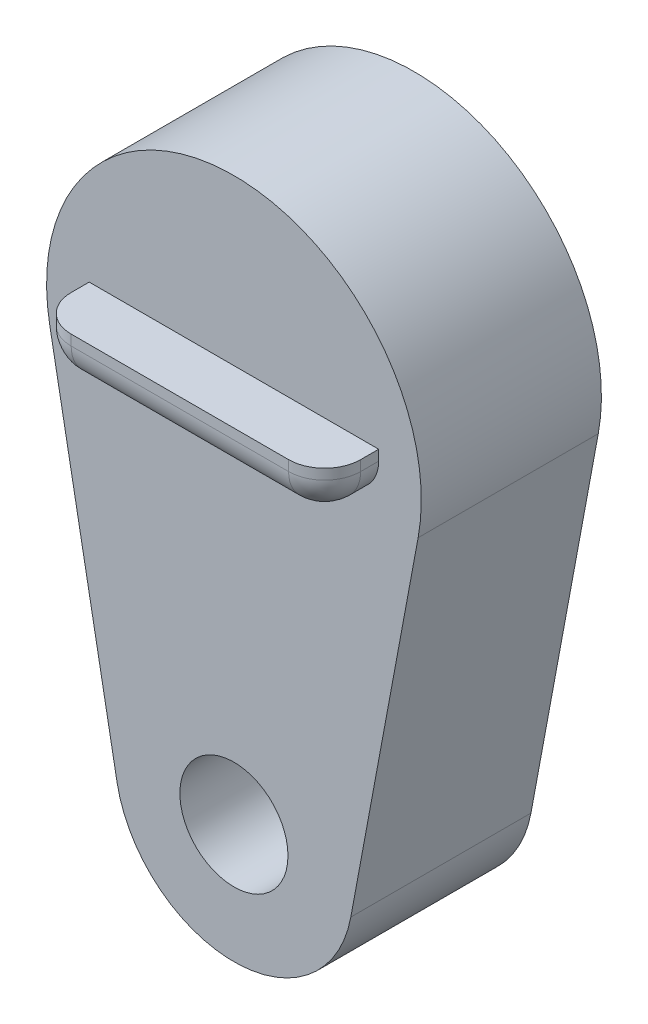
ISO-10303-21;
HEADER;
FILE_DESCRIPTION(('STEP AP214'),'2;1');
FILE_NAME('part.step','',(''),(''),'','','');
FILE_SCHEMA(('AUTOMOTIVE_DESIGN { 1 0 10303 214 1 1 1 1 }'));
ENDSEC;
DATA;
#1=APPLICATION_CONTEXT('core data for automotive mechanical design processes');
#2=APPLICATION_PROTOCOL_DEFINITION('international standard','automotive_design',2000,#1);
#3=PRODUCT_CONTEXT('',#1,'mechanical');
#4=PRODUCT('Part','Part','',(#3));
#5=PRODUCT_RELATED_PRODUCT_CATEGORY('part','',(#4));
#6=PRODUCT_DEFINITION_FORMATION('','',#4);
#7=PRODUCT_DEFINITION_CONTEXT('part definition',#1,'design');
#8=PRODUCT_DEFINITION('design','',#6,#7);
#9=PRODUCT_DEFINITION_SHAPE('','',#8);
#10=(LENGTH_UNIT() NAMED_UNIT(*) SI_UNIT(.MILLI.,.METRE.));
#11=(NAMED_UNIT(*) PLANE_ANGLE_UNIT() SI_UNIT($,.RADIAN.));
#12=(NAMED_UNIT(*) SI_UNIT($,.STERADIAN.) SOLID_ANGLE_UNIT());
#13=UNCERTAINTY_MEASURE_WITH_UNIT(LENGTH_MEASURE(1.E-05),#10,'distance_accuracy_value','');
#14=(GEOMETRIC_REPRESENTATION_CONTEXT(3) GLOBAL_UNCERTAINTY_ASSIGNED_CONTEXT((#13)) GLOBAL_UNIT_ASSIGNED_CONTEXT((#10,
#11,#12)) REPRESENTATION_CONTEXT('',''));
#15=CARTESIAN_POINT('',(0.,0.,0.));
#16=DIRECTION('',(0.,0.,1.));
#17=DIRECTION('',(1.,0.,0.));
#18=AXIS2_PLACEMENT_3D('',#15,#16,#17);
#19=CARTESIAN_POINT('',(0.,10.4,5.));
#20=DIRECTION('',(0.,0.,1.));
#21=DIRECTION('',(1.,0.,0.));
#22=AXIS2_PLACEMENT_3D('',#19,#20,#21);
#23=PLANE('',#22);
#24=DIRECTION('',(-1.,0.,0.));
#25=VECTOR('',#24,1.);
#26=CARTESIAN_POINT('',(-4.01705962822542,11.0296974330088,5.));
#27=LINE('',#26,#25);
#28=CARTESIAN_POINT('',(4.01705962823229,11.0296974330088,5.));
#29=VERTEX_POINT('',#28);
#30=CARTESIAN_POINT('',(-4.01705962822542,11.0296974330088,5.));
#31=VERTEX_POINT('',#30);
#32=EDGE_CURVE('E127',#29,#31,#27,.T.);
#33=ORIENTED_EDGE('',*,*,#32,.F.);
#34=DIRECTION('',(0.,1.,0.));
#35=VECTOR('',#34,1.);
#36=CARTESIAN_POINT('',(4.01705962823228,10.742178321397,5.));
#37=LINE('',#36,#35);
#38=CARTESIAN_POINT('',(4.01705962823229,10.742178321397,5.));
#39=VERTEX_POINT('',#38);
#40=EDGE_CURVE('E136',#39,#29,#37,.T.);
#41=ORIENTED_EDGE('',*,*,#40,.F.);
#42=CARTESIAN_POINT('',(3.01705962823228,10.742178321397,5.));
#43=DIRECTION('',(0.,0.,1.));
#44=DIRECTION('',(1.,0.,0.));
#45=AXIS2_PLACEMENT_3D('',#42,#43,#44);
#46=CIRCLE('',#45,1.);
#47=CARTESIAN_POINT('',(3.01705962823228,9.74217832139697,5.));
#48=VERTEX_POINT('',#47);
#49=EDGE_CURVE('E157',#48,#39,#46,.T.);
#50=ORIENTED_EDGE('',*,*,#49,.F.);
#51=DIRECTION('',(1.,0.,0.));
#52=VECTOR('',#51,1.);
#53=CARTESIAN_POINT('',(-3.01705962822542,9.74217832139697,5.));
#54=LINE('',#53,#52);
#55=CARTESIAN_POINT('',(-3.01705962822542,9.74217832139697,5.));
#56=VERTEX_POINT('',#55);
#57=EDGE_CURVE('E154',#56,#48,#54,.T.);
#58=ORIENTED_EDGE('',*,*,#57,.F.);
#59=CARTESIAN_POINT('',(-3.01705962822542,10.742178321397,5.));
#60=DIRECTION('',(0.,0.,1.));
#61=DIRECTION('',(-1.,0.,0.));
#62=AXIS2_PLACEMENT_3D('',#59,#60,#61);
#63=CIRCLE('',#62,1.);
#64=CARTESIAN_POINT('',(-4.01705962822542,10.742178321397,5.));
#65=VERTEX_POINT('',#64);
#66=EDGE_CURVE('E148',#65,#56,#63,.T.);
#67=ORIENTED_EDGE('',*,*,#66,.F.);
#68=DIRECTION('',(0.,-1.,0.));
#69=VECTOR('',#68,1.);
#70=CARTESIAN_POINT('',(-4.01705962822542,10.742178321397,5.));
#71=LINE('',#70,#69);
#72=EDGE_CURVE('E146',#31,#65,#71,.T.);
#73=ORIENTED_EDGE('',*,*,#72,.F.);
#74=EDGE_LOOP('',(#33,#41,#50,#58,#67,#73));
#75=FACE_BOUND('',#74,.T.);
#76=CARTESIAN_POINT('',(0.,10.4,5.));
#77=DIRECTION('',(0.,0.,1.));
#78=DIRECTION('',(1.,0.,0.));
#79=AXIS2_PLACEMENT_3D('',#76,#77,#78);
#80=CIRCLE('',#79,5.2);
#81=CARTESIAN_POINT('',(5.11248471880357,9.45,5.));
#82=VERTEX_POINT('',#81);
#83=CARTESIAN_POINT('',(-5.11248471880357,9.45,5.));
#84=VERTEX_POINT('',#83);
#85=EDGE_CURVE('E174',#82,#84,#80,.T.);
#86=ORIENTED_EDGE('',*,*,#85,.T.);
#87=DIRECTION('',(0.182692307692308,-0.983170138231455,0.));
#88=VECTOR('',#87,1.);
#89=CARTESIAN_POINT('',(-5.11248471880357,9.45,5.));
#90=LINE('',#89,#88);
#91=CARTESIAN_POINT('',(-3.2444614561638,-0.602884615384615,5.));
#92=VERTEX_POINT('',#91);
#93=EDGE_CURVE('E177',#84,#92,#90,.T.);
#94=ORIENTED_EDGE('',*,*,#93,.T.);
#95=CARTESIAN_POINT('',(0.,0.,5.));
#96=DIRECTION('',(0.,0.,1.));
#97=DIRECTION('',(1.,0.,0.));
#98=AXIS2_PLACEMENT_3D('',#95,#96,#97);
#99=CIRCLE('',#98,3.3);
#100=CARTESIAN_POINT('',(3.2444614561638,-0.602884615384615,5.));
#101=VERTEX_POINT('',#100);
#102=EDGE_CURVE('E180',#92,#101,#99,.T.);
#103=ORIENTED_EDGE('',*,*,#102,.T.);
#104=DIRECTION('',(0.182692307692308,0.983170138231456,0.));
#105=VECTOR('',#104,1.);
#106=CARTESIAN_POINT('',(3.24446145616381,-0.602884615384616,5.));
#107=LINE('',#106,#105);
#108=EDGE_CURVE('E182',#101,#82,#107,.T.);
#109=ORIENTED_EDGE('',*,*,#108,.T.);
#110=EDGE_LOOP('',(#86,#94,#103,#109));
#111=FACE_BOUND('',#110,.T.);
#112=CARTESIAN_POINT('',(0.,0.,5.));
#113=DIRECTION('',(0.,0.,1.));
#114=DIRECTION('',(1.,0.,0.));
#115=AXIS2_PLACEMENT_3D('',#112,#113,#114);
#116=CIRCLE('',#115,1.5);
#117=CARTESIAN_POINT('',(1.5,0.,5.));
#118=VERTEX_POINT('',#117);
#119=EDGE_CURVE('E168',#118,#118,#116,.T.);
#120=ORIENTED_EDGE('',*,*,#119,.F.);
#121=EDGE_LOOP('',(#120));
#122=FACE_BOUND('',#121,.T.);
#123=ADVANCED_FACE('F33',(#75,#111,#122),#23,.T.);
#124=CARTESIAN_POINT('',(0.,10.4,0.));
#125=DIRECTION('',(0.,0.,1.));
#126=DIRECTION('',(1.,0.,0.));
#127=AXIS2_PLACEMENT_3D('',#124,#125,#126);
#128=PLANE('',#127);
#129=CARTESIAN_POINT('',(0.,10.4,0.));
#130=DIRECTION('',(0.,0.,1.));
#131=DIRECTION('',(1.,0.,0.));
#132=AXIS2_PLACEMENT_3D('',#129,#130,#131);
#133=CIRCLE('',#132,5.2);
#134=CARTESIAN_POINT('',(5.11248471880357,9.45,0.));
#135=VERTEX_POINT('',#134);
#136=CARTESIAN_POINT('',(-5.11248471880357,9.45,0.));
#137=VERTEX_POINT('',#136);
#138=EDGE_CURVE('E171',#135,#137,#133,.T.);
#139=ORIENTED_EDGE('',*,*,#138,.F.);
#140=DIRECTION('',(0.182692307692308,0.983170138231456,0.));
#141=VECTOR('',#140,1.);
#142=CARTESIAN_POINT('',(3.24446145616381,-0.602884615384616,0.));
#143=LINE('',#142,#141);
#144=CARTESIAN_POINT('',(3.2444614561638,-0.602884615384615,0.));
#145=VERTEX_POINT('',#144);
#146=EDGE_CURVE('E178',#145,#135,#143,.T.);
#147=ORIENTED_EDGE('',*,*,#146,.F.);
#148=CARTESIAN_POINT('',(0.,0.,0.));
#149=DIRECTION('',(0.,0.,1.));
#150=DIRECTION('',(1.,0.,0.));
#151=AXIS2_PLACEMENT_3D('',#148,#149,#150);
#152=CIRCLE('',#151,3.3);
#153=CARTESIAN_POINT('',(-3.2444614561638,-0.602884615384615,0.));
#154=VERTEX_POINT('',#153);
#155=EDGE_CURVE('E189',#154,#145,#152,.T.);
#156=ORIENTED_EDGE('',*,*,#155,.F.);
#157=DIRECTION('',(0.182692307692308,-0.983170138231455,0.));
#158=VECTOR('',#157,1.);
#159=CARTESIAN_POINT('',(-5.11248471880357,9.45,0.));
#160=LINE('',#159,#158);
#161=EDGE_CURVE('E187',#137,#154,#160,.T.);
#162=ORIENTED_EDGE('',*,*,#161,.F.);
#163=EDGE_LOOP('',(#139,#147,#156,#162));
#164=FACE_BOUND('',#163,.T.);
#165=CARTESIAN_POINT('',(0.,0.,0.));
#166=DIRECTION('',(0.,0.,1.));
#167=DIRECTION('',(1.,0.,0.));
#168=AXIS2_PLACEMENT_3D('',#165,#166,#167);
#169=CIRCLE('',#168,1.5);
#170=CARTESIAN_POINT('',(1.5,0.,0.));
#171=VERTEX_POINT('',#170);
#172=EDGE_CURVE('E132',#171,#171,#169,.T.);
#173=ORIENTED_EDGE('',*,*,#172,.T.);
#174=EDGE_LOOP('',(#173));
#175=FACE_BOUND('',#174,.T.);
#176=ADVANCED_FACE('F257',(#164,#175),#128,.F.);
#177=CARTESIAN_POINT('',(0.,10.4,5.));
#178=DIRECTION('',(0.,0.,-1.));
#179=DIRECTION('',(-1.,0.,0.));
#180=AXIS2_PLACEMENT_3D('',#177,#178,#179);
#181=CYLINDRICAL_SURFACE('',#180,5.2);
#182=ORIENTED_EDGE('',*,*,#138,.T.);
#183=DIRECTION('',(0.,0.,-1.));
#184=VECTOR('',#183,1.);
#185=CARTESIAN_POINT('',(-5.11248471880357,9.45,5.));
#186=LINE('',#185,#184);
#187=EDGE_CURVE('E200',#84,#137,#186,.T.);
#188=ORIENTED_EDGE('',*,*,#187,.F.);
#189=ORIENTED_EDGE('',*,*,#85,.F.);
#190=DIRECTION('',(0.,0.,-1.));
#191=VECTOR('',#190,1.);
#192=CARTESIAN_POINT('',(5.11248471880357,9.45,5.));
#193=LINE('',#192,#191);
#194=EDGE_CURVE('E184',#82,#135,#193,.T.);
#195=ORIENTED_EDGE('',*,*,#194,.T.);
#196=EDGE_LOOP('',(#182,#188,#189,#195));
#197=FACE_BOUND('',#196,.T.);
#198=ADVANCED_FACE('F262',(#197),#181,.T.);
#199=CARTESIAN_POINT('',(-5.11248471880357,9.45,5.));
#200=DIRECTION('',(0.983170138231455,0.182692307692308,0.));
#201=DIRECTION('',(-0.182692307692308,0.983170138231455,0.));
#202=AXIS2_PLACEMENT_3D('',#199,#200,#201);
#203=PLANE('',#202);
#204=ORIENTED_EDGE('',*,*,#161,.T.);
#205=DIRECTION('',(0.,0.,-1.));
#206=VECTOR('',#205,1.);
#207=CARTESIAN_POINT('',(-3.2444614561638,-0.602884615384615,5.));
#208=LINE('',#207,#206);
#209=EDGE_CURVE('E197',#92,#154,#208,.T.);
#210=ORIENTED_EDGE('',*,*,#209,.F.);
#211=ORIENTED_EDGE('',*,*,#93,.F.);
#212=ORIENTED_EDGE('',*,*,#187,.T.);
#213=EDGE_LOOP('',(#204,#210,#211,#212));
#214=FACE_BOUND('',#213,.T.);
#215=ADVANCED_FACE('F276',(#214),#203,.F.);
#216=CARTESIAN_POINT('',(0.,0.,5.));
#217=DIRECTION('',(0.,0.,-1.));
#218=DIRECTION('',(-1.,0.,0.));
#219=AXIS2_PLACEMENT_3D('',#216,#217,#218);
#220=CYLINDRICAL_SURFACE('',#219,3.3);
#221=ORIENTED_EDGE('',*,*,#155,.T.);
#222=DIRECTION('',(0.,0.,-1.));
#223=VECTOR('',#222,1.);
#224=CARTESIAN_POINT('',(3.2444614561638,-0.602884615384615,5.));
#225=LINE('',#224,#223);
#226=EDGE_CURVE('E194',#101,#145,#225,.T.);
#227=ORIENTED_EDGE('',*,*,#226,.F.);
#228=ORIENTED_EDGE('',*,*,#102,.F.);
#229=ORIENTED_EDGE('',*,*,#209,.T.);
#230=EDGE_LOOP('',(#221,#227,#228,#229));
#231=FACE_BOUND('',#230,.T.);
#232=ADVANCED_FACE('F272',(#231),#220,.T.);
#233=CARTESIAN_POINT('',(3.24446145616381,-0.602884615384616,5.));
#234=DIRECTION('',(-0.983170138231455,0.182692307692308,0.));
#235=DIRECTION('',(-0.182692307692308,-0.983170138231455,0.));
#236=AXIS2_PLACEMENT_3D('',#233,#234,#235);
#237=PLANE('',#236);
#238=ORIENTED_EDGE('',*,*,#146,.T.);
#239=ORIENTED_EDGE('',*,*,#194,.F.);
#240=ORIENTED_EDGE('',*,*,#108,.F.);
#241=ORIENTED_EDGE('',*,*,#226,.T.);
#242=EDGE_LOOP('',(#238,#239,#240,#241));
#243=FACE_BOUND('',#242,.T.);
#244=ADVANCED_FACE('F269',(#243),#237,.F.);
#245=CARTESIAN_POINT('',(0.,0.,5.));
#246=DIRECTION('',(0.,0.,-1.));
#247=DIRECTION('',(-1.,0.,0.));
#248=AXIS2_PLACEMENT_3D('',#245,#246,#247);
#249=CYLINDRICAL_SURFACE('',#248,1.5);
#250=ORIENTED_EDGE('',*,*,#119,.T.);
#251=EDGE_LOOP('',(#250));
#252=FACE_BOUND('',#251,.T.);
#253=ORIENTED_EDGE('',*,*,#172,.F.);
#254=EDGE_LOOP('',(#253));
#255=FACE_BOUND('',#254,.T.);
#256=ADVANCED_FACE('F266',(#252,#255),#249,.F.);
#257=CARTESIAN_POINT('',(4.01705962823228,10.742178321397,6.5));
#258=DIRECTION('',(-1.,0.,0.));
#259=DIRECTION('',(0.,-1.,0.));
#260=AXIS2_PLACEMENT_3D('',#257,#258,#259);
#261=PLANE('',#260);
#262=DIRECTION('',(0.,0.,-1.));
#263=VECTOR('',#262,1.);
#264=CARTESIAN_POINT('',(4.01705962823229,11.0296974330088,6.5));
#265=LINE('',#264,#263);
#266=CARTESIAN_POINT('',(4.01705962823229,11.0296974330088,5.5));
#267=VERTEX_POINT('',#266);
#268=EDGE_CURVE('E122',#267,#29,#265,.T.);
#269=ORIENTED_EDGE('',*,*,#268,.F.);
#270=DIRECTION('',(0.,1.,0.));
#271=VECTOR('',#270,1.);
#272=CARTESIAN_POINT('',(4.01705962823228,10.742178321397,5.5));
#273=LINE('',#272,#271);
#274=CARTESIAN_POINT('',(4.01705962823229,10.742178321397,5.5));
#275=VERTEX_POINT('',#274);
#276=EDGE_CURVE('E57',#267,#275,#273,.F.);
#277=ORIENTED_EDGE('',*,*,#276,.T.);
#278=DIRECTION('',(0.,0.,-1.));
#279=VECTOR('',#278,1.);
#280=CARTESIAN_POINT('',(4.01705962823229,10.742178321397,6.5));
#281=LINE('',#280,#279);
#282=EDGE_CURVE('E138',#275,#39,#281,.T.);
#283=ORIENTED_EDGE('',*,*,#282,.T.);
#284=ORIENTED_EDGE('',*,*,#40,.T.);
#285=EDGE_LOOP('',(#269,#277,#283,#284));
#286=FACE_BOUND('',#285,.T.);
#287=ADVANCED_FACE('F137',(#286),#261,.F.);
#288=CARTESIAN_POINT('',(-4.01705962822542,11.0296974330088,6.5));
#289=DIRECTION('',(0.,-1.,0.));
#290=DIRECTION('',(0.,0.,-1.));
#291=AXIS2_PLACEMENT_3D('',#288,#289,#290);
#292=PLANE('',#291);
#293=DIRECTION('',(0.,0.,-1.));
#294=VECTOR('',#293,1.);
#295=CARTESIAN_POINT('',(-4.01705962822542,11.0296974330088,6.5));
#296=LINE('',#295,#294);
#297=CARTESIAN_POINT('',(-4.01705962822542,11.0296974330088,5.5));
#298=VERTEX_POINT('',#297);
#299=EDGE_CURVE('E133',#298,#31,#296,.T.);
#300=ORIENTED_EDGE('',*,*,#299,.F.);
#301=CARTESIAN_POINT('',(-3.01705962822542,11.0296974330088,5.5));
#302=DIRECTION('',(0.,-1.,0.));
#303=DIRECTION('',(0.,0.,-1.));
#304=AXIS2_PLACEMENT_3D('',#301,#302,#303);
#305=CIRCLE('',#304,1.);
#306=CARTESIAN_POINT('',(-3.01705962822542,11.0296974330088,6.5));
#307=VERTEX_POINT('',#306);
#308=EDGE_CURVE('E213',#298,#307,#305,.F.);
#309=ORIENTED_EDGE('',*,*,#308,.T.);
#310=DIRECTION('',(-1.,0.,0.));
#311=VECTOR('',#310,1.);
#312=CARTESIAN_POINT('',(-4.01705962822542,11.0296974330088,6.5));
#313=LINE('',#312,#311);
#314=CARTESIAN_POINT('',(3.01705962823229,11.0296974330088,6.5));
#315=VERTEX_POINT('',#314);
#316=EDGE_CURVE('E159',#315,#307,#313,.T.);
#317=ORIENTED_EDGE('',*,*,#316,.F.);
#318=CARTESIAN_POINT('',(3.01705962823229,11.0296974330088,5.5));
#319=DIRECTION('',(0.,-1.,0.));
#320=DIRECTION('',(0.,0.,-1.));
#321=AXIS2_PLACEMENT_3D('',#318,#319,#320);
#322=CIRCLE('',#321,1.);
#323=EDGE_CURVE('E131',#315,#267,#322,.F.);
#324=ORIENTED_EDGE('',*,*,#323,.T.);
#325=ORIENTED_EDGE('',*,*,#268,.T.);
#326=ORIENTED_EDGE('',*,*,#32,.T.);
#327=EDGE_LOOP('',(#300,#309,#317,#324,#325,#326));
#328=FACE_BOUND('',#327,.T.);
#329=ADVANCED_FACE('F125',(#328),#292,.F.);
#330=CARTESIAN_POINT('',(-4.01705962822542,10.742178321397,6.5));
#331=DIRECTION('',(1.,0.,0.));
#332=DIRECTION('',(0.,0.,-1.));
#333=AXIS2_PLACEMENT_3D('',#330,#331,#332);
#334=PLANE('',#333);
#335=DIRECTION('',(0.,0.,-1.));
#336=VECTOR('',#335,1.);
#337=CARTESIAN_POINT('',(-4.01705962822542,10.742178321397,6.5));
#338=LINE('',#337,#336);
#339=CARTESIAN_POINT('',(-4.01705962822542,10.742178321397,5.5));
#340=VERTEX_POINT('',#339);
#341=EDGE_CURVE('E165',#340,#65,#338,.T.);
#342=ORIENTED_EDGE('',*,*,#341,.F.);
#343=DIRECTION('',(0.,-1.,0.));
#344=VECTOR('',#343,1.);
#345=CARTESIAN_POINT('',(-4.01705962822542,10.742178321397,5.5));
#346=LINE('',#345,#344);
#347=EDGE_CURVE('E210',#340,#298,#346,.F.);
#348=ORIENTED_EDGE('',*,*,#347,.T.);
#349=ORIENTED_EDGE('',*,*,#299,.T.);
#350=ORIENTED_EDGE('',*,*,#72,.T.);
#351=EDGE_LOOP('',(#342,#348,#349,#350));
#352=FACE_BOUND('',#351,.T.);
#353=ADVANCED_FACE('F345',(#352),#334,.F.);
#354=CARTESIAN_POINT('',(-3.01705962822542,10.742178321397,6.5));
#355=DIRECTION('',(0.,0.,-1.));
#356=DIRECTION('',(-1.,0.,0.));
#357=AXIS2_PLACEMENT_3D('',#354,#355,#356);
#358=CYLINDRICAL_SURFACE('',#357,1.);
#359=DIRECTION('',(0.,0.,-1.));
#360=VECTOR('',#359,1.);
#361=CARTESIAN_POINT('',(-3.01705962822542,9.74217832139697,6.5));
#362=LINE('',#361,#360);
#363=CARTESIAN_POINT('',(-3.01705962822542,9.74217832139697,5.5));
#364=VERTEX_POINT('',#363);
#365=EDGE_CURVE('E163',#364,#56,#362,.T.);
#366=ORIENTED_EDGE('',*,*,#365,.F.);
#367=CARTESIAN_POINT('',(-3.01705962822542,10.742178321397,5.5));
#368=DIRECTION('',(0.,0.,-1.));
#369=DIRECTION('',(-1.,0.,0.));
#370=AXIS2_PLACEMENT_3D('',#367,#368,#369);
#371=CIRCLE('',#370,1.);
#372=EDGE_CURVE('E215',#364,#340,#371,.T.);
#373=ORIENTED_EDGE('',*,*,#372,.T.);
#374=ORIENTED_EDGE('',*,*,#341,.T.);
#375=ORIENTED_EDGE('',*,*,#66,.T.);
#376=EDGE_LOOP('',(#366,#373,#374,#375));
#377=FACE_BOUND('',#376,.T.);
#378=ADVANCED_FACE('F335',(#377),#358,.T.);
#379=CARTESIAN_POINT('',(-3.01705962822542,9.74217832139697,6.5));
#380=DIRECTION('',(0.,1.,0.));
#381=DIRECTION('',(0.,0.,1.));
#382=AXIS2_PLACEMENT_3D('',#379,#380,#381);
#383=PLANE('',#382);
#384=DIRECTION('',(0.,0.,-1.));
#385=VECTOR('',#384,1.);
#386=CARTESIAN_POINT('',(3.01705962823228,9.74217832139697,6.5));
#387=LINE('',#386,#385);
#388=CARTESIAN_POINT('',(3.01705962823228,9.74217832139697,5.5));
#389=VERTEX_POINT('',#388);
#390=EDGE_CURVE('E161',#389,#48,#387,.T.);
#391=ORIENTED_EDGE('',*,*,#390,.F.);
#392=DIRECTION('',(1.,0.,0.));
#393=VECTOR('',#392,1.);
#394=CARTESIAN_POINT('',(-3.01705962822542,9.74217832139697,5.5));
#395=LINE('',#394,#393);
#396=EDGE_CURVE('E11',#389,#364,#395,.F.);
#397=ORIENTED_EDGE('',*,*,#396,.T.);
#398=ORIENTED_EDGE('',*,*,#365,.T.);
#399=ORIENTED_EDGE('',*,*,#57,.T.);
#400=EDGE_LOOP('',(#391,#397,#398,#399));
#401=FACE_BOUND('',#400,.T.);
#402=ADVANCED_FACE('F326',(#401),#383,.F.);
#403=CARTESIAN_POINT('',(3.01705962823228,10.742178321397,6.5));
#404=DIRECTION('',(0.,0.,-1.));
#405=DIRECTION('',(-1.,0.,0.));
#406=AXIS2_PLACEMENT_3D('',#403,#404,#405);
#407=CYLINDRICAL_SURFACE('',#406,1.);
#408=ORIENTED_EDGE('',*,*,#282,.F.);
#409=CARTESIAN_POINT('',(3.01705962823228,10.742178321397,5.5));
#410=DIRECTION('',(0.,0.,-1.));
#411=DIRECTION('',(-1.,0.,0.));
#412=AXIS2_PLACEMENT_3D('',#409,#410,#411);
#413=CIRCLE('',#412,1.);
#414=EDGE_CURVE('E42',#275,#389,#413,.T.);
#415=ORIENTED_EDGE('',*,*,#414,.T.);
#416=ORIENTED_EDGE('',*,*,#390,.T.);
#417=ORIENTED_EDGE('',*,*,#49,.T.);
#418=EDGE_LOOP('',(#408,#415,#416,#417));
#419=FACE_BOUND('',#418,.T.);
#420=ADVANCED_FACE('F317',(#419),#407,.T.);
#421=CARTESIAN_POINT('',(-3.01705962822542,10.742178321397,6.5));
#422=DIRECTION('',(0.,0.,-1.));
#423=DIRECTION('',(-1.,0.,0.));
#424=AXIS2_PLACEMENT_3D('',#421,#422,#423);
#425=PLANE('',#424);
#426=ORIENTED_EDGE('',*,*,#316,.T.);
#427=DIRECTION('',(0.,-1.,0.));
#428=VECTOR('',#427,1.);
#429=CARTESIAN_POINT('',(-3.01705962822542,10.742178321397,6.5));
#430=LINE('',#429,#428);
#431=CARTESIAN_POINT('',(-3.01705962822542,10.742178321397,6.5));
#432=VERTEX_POINT('',#431);
#433=EDGE_CURVE('E207',#307,#432,#430,.T.);
#434=ORIENTED_EDGE('',*,*,#433,.T.);
#435=DIRECTION('',(1.,0.,0.));
#436=VECTOR('',#435,1.);
#437=CARTESIAN_POINT('',(-3.01705962822542,10.742178321397,6.5));
#438=LINE('',#437,#436);
#439=CARTESIAN_POINT('',(3.01705962823228,10.742178321397,6.5));
#440=VERTEX_POINT('',#439);
#441=EDGE_CURVE('E203',#432,#440,#438,.T.);
#442=ORIENTED_EDGE('',*,*,#441,.T.);
#443=DIRECTION('',(0.,1.,0.));
#444=VECTOR('',#443,1.);
#445=CARTESIAN_POINT('',(3.01705962823228,10.742178321397,6.5));
#446=LINE('',#445,#444);
#447=EDGE_CURVE('E205',#440,#315,#446,.T.);
#448=ORIENTED_EDGE('',*,*,#447,.T.);
#449=EDGE_LOOP('',(#426,#434,#442,#448));
#450=FACE_BOUND('',#449,.T.);
#451=ADVANCED_FACE('F237',(#450),#425,.F.);
#452=CARTESIAN_POINT('',(3.01705962823228,10.742178321397,5.5));
#453=DIRECTION('',(0.,1.,0.));
#454=DIRECTION('',(-1.,0.,0.));
#455=AXIS2_PLACEMENT_3D('',#452,#453,#454);
#456=CYLINDRICAL_SURFACE('',#455,1.);
#457=CARTESIAN_POINT('',(3.01705962823228,10.742178321397,5.5));
#458=DIRECTION('',(0.,-1.,0.));
#459=DIRECTION('',(1.,0.,0.));
#460=AXIS2_PLACEMENT_3D('',#457,#458,#459);
#461=CIRCLE('',#460,1.);
#462=EDGE_CURVE('E37',#275,#440,#461,.T.);
#463=ORIENTED_EDGE('',*,*,#462,.F.);
#464=ORIENTED_EDGE('',*,*,#276,.F.);
#465=ORIENTED_EDGE('',*,*,#323,.F.);
#466=ORIENTED_EDGE('',*,*,#447,.F.);
#467=EDGE_LOOP('',(#463,#464,#465,#466));
#468=FACE_BOUND('',#467,.T.);
#469=ADVANCED_FACE('F35',(#468),#456,.T.);
#470=CARTESIAN_POINT('',(3.01705962823228,10.742178321397,5.5));
#471=DIRECTION('',(0.,0.,-1.));
#472=DIRECTION('',(-1.,0.,0.));
#473=AXIS2_PLACEMENT_3D('',#470,#471,#472);
#474=SPHERICAL_SURFACE('',#473,1.);
#475=ORIENTED_EDGE('',*,*,#414,.F.);
#476=ORIENTED_EDGE('',*,*,#462,.T.);
#477=CARTESIAN_POINT('',(3.01705962823228,10.742178321397,5.5));
#478=DIRECTION('',(-1.,0.,0.));
#479=DIRECTION('',(0.,0.,1.));
#480=AXIS2_PLACEMENT_3D('',#477,#478,#479);
#481=CIRCLE('',#480,1.);
#482=EDGE_CURVE('E223',#389,#440,#481,.T.);
#483=ORIENTED_EDGE('',*,*,#482,.F.);
#484=EDGE_LOOP('',(#475,#476,#483));
#485=FACE_BOUND('',#484,.T.);
#486=ADVANCED_FACE('F232',(#485),#474,.T.);
#487=CARTESIAN_POINT('',(-3.01705962822542,10.742178321397,5.5));
#488=DIRECTION('',(1.,0.,0.));
#489=DIRECTION('',(0.,0.,-1.));
#490=AXIS2_PLACEMENT_3D('',#487,#488,#489);
#491=CYLINDRICAL_SURFACE('',#490,1.);
#492=CARTESIAN_POINT('',(-3.01705962822542,10.742178321397,5.5));
#493=DIRECTION('',(-1.,0.,0.));
#494=DIRECTION('',(0.,0.,1.));
#495=AXIS2_PLACEMENT_3D('',#492,#493,#494);
#496=CIRCLE('',#495,1.);
#497=EDGE_CURVE('E221',#364,#432,#496,.T.);
#498=ORIENTED_EDGE('',*,*,#497,.F.);
#499=ORIENTED_EDGE('',*,*,#396,.F.);
#500=ORIENTED_EDGE('',*,*,#482,.T.);
#501=ORIENTED_EDGE('',*,*,#441,.F.);
#502=EDGE_LOOP('',(#498,#499,#500,#501));
#503=FACE_BOUND('',#502,.T.);
#504=ADVANCED_FACE('F248',(#503),#491,.T.);
#505=CARTESIAN_POINT('',(-3.01705962822542,10.742178321397,5.5));
#506=DIRECTION('',(0.,0.,-1.));
#507=DIRECTION('',(-1.,0.,0.));
#508=AXIS2_PLACEMENT_3D('',#505,#506,#507);
#509=SPHERICAL_SURFACE('',#508,1.);
#510=ORIENTED_EDGE('',*,*,#372,.F.);
#511=ORIENTED_EDGE('',*,*,#497,.T.);
#512=CARTESIAN_POINT('',(-3.01705962822542,10.742178321397,5.5));
#513=DIRECTION('',(0.,1.,0.));
#514=DIRECTION('',(0.,0.,1.));
#515=AXIS2_PLACEMENT_3D('',#512,#513,#514);
#516=CIRCLE('',#515,1.);
#517=EDGE_CURVE('E219',#340,#432,#516,.T.);
#518=ORIENTED_EDGE('',*,*,#517,.F.);
#519=EDGE_LOOP('',(#510,#511,#518));
#520=FACE_BOUND('',#519,.T.);
#521=ADVANCED_FACE('F247',(#520),#509,.T.);
#522=CARTESIAN_POINT('',(-3.01705962822542,10.742178321397,5.5));
#523=DIRECTION('',(0.,-1.,0.));
#524=DIRECTION('',(0.,0.,-1.));
#525=AXIS2_PLACEMENT_3D('',#522,#523,#524);
#526=CYLINDRICAL_SURFACE('',#525,1.);
#527=ORIENTED_EDGE('',*,*,#308,.F.);
#528=ORIENTED_EDGE('',*,*,#347,.F.);
#529=ORIENTED_EDGE('',*,*,#517,.T.);
#530=ORIENTED_EDGE('',*,*,#433,.F.);
#531=EDGE_LOOP('',(#527,#528,#529,#530));
#532=FACE_BOUND('',#531,.T.);
#533=ADVANCED_FACE('F242',(#532),#526,.T.);
#534=CLOSED_SHELL('',(#123,#176,#198,#215,#232,#244,#256,#287,#329,#353,#378,#402,#420,#451,
#469,#486,#504,#521,#533));
#535=MANIFOLD_SOLID_BREP('B2',#534);
#536=ADVANCED_BREP_SHAPE_REPRESENTATION('',(#18,#535),#14);
#537=SHAPE_DEFINITION_REPRESENTATION(#9,#536);
ENDSEC;
END-ISO-10303-21;
